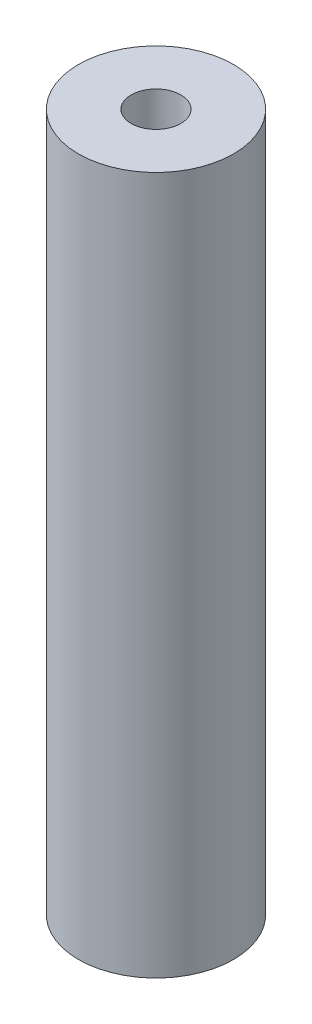
ISO-10303-21;
HEADER;
FILE_DESCRIPTION(('STEP AP214'),'2;1');
FILE_NAME('part.step','',(''),(''),'','','');
FILE_SCHEMA(('AUTOMOTIVE_DESIGN { 1 0 10303 214 1 1 1 1 }'));
ENDSEC;
DATA;
#1=APPLICATION_CONTEXT('core data for automotive mechanical design processes');
#2=APPLICATION_PROTOCOL_DEFINITION('international standard','automotive_design',2000,#1);
#3=PRODUCT_CONTEXT('',#1,'mechanical');
#4=PRODUCT('Part','Part','',(#3));
#5=PRODUCT_RELATED_PRODUCT_CATEGORY('part','',(#4));
#6=PRODUCT_DEFINITION_FORMATION('','',#4);
#7=PRODUCT_DEFINITION_CONTEXT('part definition',#1,'design');
#8=PRODUCT_DEFINITION('design','',#6,#7);
#9=PRODUCT_DEFINITION_SHAPE('','',#8);
#10=(LENGTH_UNIT() NAMED_UNIT(*) SI_UNIT(.MILLI.,.METRE.));
#11=(NAMED_UNIT(*) PLANE_ANGLE_UNIT() SI_UNIT($,.RADIAN.));
#12=(NAMED_UNIT(*) SI_UNIT($,.STERADIAN.) SOLID_ANGLE_UNIT());
#13=UNCERTAINTY_MEASURE_WITH_UNIT(LENGTH_MEASURE(1.E-05),#10,'distance_accuracy_value','');
#14=(GEOMETRIC_REPRESENTATION_CONTEXT(3) GLOBAL_UNCERTAINTY_ASSIGNED_CONTEXT((#13)) GLOBAL_UNIT_ASSIGNED_CONTEXT((#10,
#11,#12)) REPRESENTATION_CONTEXT('',''));
#15=CARTESIAN_POINT('',(0.,0.,0.));
#16=DIRECTION('',(0.,0.,1.));
#17=DIRECTION('',(1.,0.,0.));
#18=AXIS2_PLACEMENT_3D('',#15,#16,#17);
#19=CARTESIAN_POINT('',(0.,45.,0.));
#20=DIRECTION('',(0.,1.,0.));
#21=DIRECTION('',(0.,0.,1.));
#22=AXIS2_PLACEMENT_3D('',#19,#20,#21);
#23=PLANE('',#22);
#24=CARTESIAN_POINT('',(0.,45.,0.));
#25=DIRECTION('',(0.,1.,0.));
#26=DIRECTION('',(0.,0.,1.));
#27=AXIS2_PLACEMENT_3D('',#24,#25,#26);
#28=CIRCLE('',#27,5.);
#29=CARTESIAN_POINT('',(0.,45.,-5.));
#30=VERTEX_POINT('',#29);
#31=EDGE_CURVE('E10',#30,#30,#28,.T.);
#32=ORIENTED_EDGE('',*,*,#31,.T.);
#33=EDGE_LOOP('',(#32));
#34=FACE_BOUND('',#33,.T.);
#35=CARTESIAN_POINT('',(0.,45.,0.));
#36=DIRECTION('',(0.,1.,0.));
#37=DIRECTION('',(0.,0.,1.));
#38=AXIS2_PLACEMENT_3D('',#35,#36,#37);
#39=CIRCLE('',#38,1.6);
#40=CARTESIAN_POINT('',(0.,45.,-1.6));
#41=VERTEX_POINT('',#40);
#42=EDGE_CURVE('E52',#41,#41,#39,.T.);
#43=ORIENTED_EDGE('',*,*,#42,.F.);
#44=EDGE_LOOP('',(#43));
#45=FACE_BOUND('',#44,.T.);
#46=ADVANCED_FACE('F41',(#34,#45),#23,.T.);
#47=CARTESIAN_POINT('',(0.,0.,0.));
#48=DIRECTION('',(0.,1.,0.));
#49=DIRECTION('',(0.,0.,1.));
#50=AXIS2_PLACEMENT_3D('',#47,#48,#49);
#51=PLANE('',#50);
#52=CARTESIAN_POINT('',(0.,0.,0.));
#53=DIRECTION('',(0.,1.,0.));
#54=DIRECTION('',(0.,0.,1.));
#55=AXIS2_PLACEMENT_3D('',#52,#53,#54);
#56=CIRCLE('',#55,5.);
#57=CARTESIAN_POINT('',(0.,0.,-5.));
#58=VERTEX_POINT('',#57);
#59=EDGE_CURVE('E45',#58,#58,#56,.T.);
#60=ORIENTED_EDGE('',*,*,#59,.F.);
#61=EDGE_LOOP('',(#60));
#62=FACE_BOUND('',#61,.T.);
#63=CARTESIAN_POINT('',(0.,0.,0.));
#64=DIRECTION('',(0.,1.,0.));
#65=DIRECTION('',(0.,0.,1.));
#66=AXIS2_PLACEMENT_3D('',#63,#64,#65);
#67=CIRCLE('',#66,1.6);
#68=CARTESIAN_POINT('',(0.,0.,-1.6));
#69=VERTEX_POINT('',#68);
#70=EDGE_CURVE('E54',#69,#69,#67,.T.);
#71=ORIENTED_EDGE('',*,*,#70,.T.);
#72=EDGE_LOOP('',(#71));
#73=FACE_BOUND('',#72,.T.);
#74=ADVANCED_FACE('F64',(#62,#73),#51,.F.);
#75=CARTESIAN_POINT('',(0.,45.,0.));
#76=DIRECTION('',(0.,-1.,0.));
#77=DIRECTION('',(0.,0.,-1.));
#78=AXIS2_PLACEMENT_3D('',#75,#76,#77);
#79=CYLINDRICAL_SURFACE('',#78,5.);
#80=CARTESIAN_POINT('',(0.,45.,-5.));
#81=CARTESIAN_POINT('',(0.,44.53125,-5.));
#82=CARTESIAN_POINT('',(0.,44.0625,-5.));
#83=CARTESIAN_POINT('',(0.,43.125,-5.));
#84=CARTESIAN_POINT('',(0.,42.65625,-5.));
#85=CARTESIAN_POINT('',(0.,41.71875,-5.));
#86=CARTESIAN_POINT('',(0.,41.25,-5.));
#87=CARTESIAN_POINT('',(0.,40.3125,-5.));
#88=CARTESIAN_POINT('',(0.,39.84375,-5.));
#89=CARTESIAN_POINT('',(0.,38.90625,-5.));
#90=CARTESIAN_POINT('',(0.,38.4375,-5.));
#91=CARTESIAN_POINT('',(0.,37.5,-5.));
#92=CARTESIAN_POINT('',(0.,37.03125,-5.));
#93=CARTESIAN_POINT('',(0.,36.09375,-5.));
#94=CARTESIAN_POINT('',(0.,35.625,-5.));
#95=CARTESIAN_POINT('',(0.,34.6875,-5.));
#96=CARTESIAN_POINT('',(0.,34.21875,-5.));
#97=CARTESIAN_POINT('',(0.,33.28125,-5.));
#98=CARTESIAN_POINT('',(0.,32.8125,-5.));
#99=CARTESIAN_POINT('',(0.,31.875,-5.));
#100=CARTESIAN_POINT('',(0.,31.40625,-5.));
#101=CARTESIAN_POINT('',(0.,30.46875,-5.));
#102=CARTESIAN_POINT('',(0.,30.,-5.));
#103=CARTESIAN_POINT('',(0.,29.0625,-5.));
#104=CARTESIAN_POINT('',(0.,28.59375,-5.));
#105=CARTESIAN_POINT('',(0.,27.65625,-5.));
#106=CARTESIAN_POINT('',(0.,27.1875,-5.));
#107=CARTESIAN_POINT('',(0.,26.25,-5.));
#108=CARTESIAN_POINT('',(0.,25.78125,-5.));
#109=CARTESIAN_POINT('',(0.,24.84375,-5.));
#110=CARTESIAN_POINT('',(0.,24.375,-5.));
#111=CARTESIAN_POINT('',(0.,23.4375,-5.));
#112=CARTESIAN_POINT('',(0.,22.96875,-5.));
#113=CARTESIAN_POINT('',(0.,22.03125,-5.));
#114=CARTESIAN_POINT('',(0.,21.5625,-5.));
#115=CARTESIAN_POINT('',(0.,20.625,-5.));
#116=CARTESIAN_POINT('',(0.,20.15625,-5.));
#117=CARTESIAN_POINT('',(0.,19.21875,-5.));
#118=CARTESIAN_POINT('',(0.,18.75,-5.));
#119=CARTESIAN_POINT('',(0.,17.8125,-5.));
#120=CARTESIAN_POINT('',(0.,17.34375,-5.));
#121=CARTESIAN_POINT('',(0.,16.40625,-5.));
#122=CARTESIAN_POINT('',(0.,15.9375,-5.));
#123=CARTESIAN_POINT('',(0.,15.,-5.));
#124=CARTESIAN_POINT('',(0.,14.53125,-5.));
#125=CARTESIAN_POINT('',(0.,13.59375,-5.));
#126=CARTESIAN_POINT('',(0.,13.125,-5.));
#127=CARTESIAN_POINT('',(0.,12.1875,-5.));
#128=CARTESIAN_POINT('',(0.,11.71875,-5.));
#129=CARTESIAN_POINT('',(0.,10.78125,-5.));
#130=CARTESIAN_POINT('',(0.,10.3125,-5.));
#131=CARTESIAN_POINT('',(0.,9.375,-5.));
#132=CARTESIAN_POINT('',(0.,8.90625,-5.));
#133=CARTESIAN_POINT('',(0.,7.96874999999999,-5.));
#134=CARTESIAN_POINT('',(0.,7.5,-5.));
#135=CARTESIAN_POINT('',(0.,6.5625,-5.));
#136=CARTESIAN_POINT('',(0.,6.09375,-5.));
#137=CARTESIAN_POINT('',(0.,5.15625,-5.));
#138=CARTESIAN_POINT('',(0.,4.68749999999999,-5.));
#139=CARTESIAN_POINT('',(0.,3.74999999999999,-5.));
#140=CARTESIAN_POINT('',(0.,3.28124999999999,-5.));
#141=CARTESIAN_POINT('',(0.,2.34374999999999,-5.));
#142=CARTESIAN_POINT('',(0.,1.87499999999999,-5.));
#143=CARTESIAN_POINT('',(0.,0.937499999999992,-5.));
#144=CARTESIAN_POINT('',(0.,0.468749999999993,-5.));
#145=CARTESIAN_POINT('',(0.,0.,-5.));
#146=B_SPLINE_CURVE_WITH_KNOTS('',3,(#80,#81,#82,#83,#84,#85,#86,#87,#88,#89,#90,#91,#92,#93,
#94,#95,#96,#97,#98,#99,#100,#101,#102,#103,#104,#105,#106,#107,#108,#109,#110,#111,#112,#113,
#114,#115,#116,#117,#118,#119,#120,#121,#122,#123,#124,#125,#126,#127,#128,#129,#130,#131,#132,
#133,#134,#135,#136,#137,#138,#139,#140,#141,#142,#143,#144,#145),.UNSPECIFIED.,.F.,.F.,(4,2,2,
2,2,2,2,2,2,2,2,2,2,2,2,2,2,2,2,2,2,2,2,2,2,2,2,2,2,2,2,2,4),(0.,1.40625,2.8125,
4.21875000000001,5.62500000000001,7.03125,8.4375,9.84375000000001,11.25,12.65625,14.0625,
15.46875,16.875,18.28125,19.6875,21.09375,22.5,23.90625,25.3125,26.71875,28.125,29.53125,
30.9375,32.34375,33.75,35.15625,36.5625,37.96875,39.375,40.78125,42.1875,43.59375,45.),.UNSPECIFIED.);
#147=EDGE_CURVE('BSEAM43',#30,#58,#146,.T.);
#148=ORIENTED_EDGE('',*,*,#31,.F.);
#149=ORIENTED_EDGE('',*,*,#59,.T.);
#150=ORIENTED_EDGE('',*,*,#147,.T.);
#151=ORIENTED_EDGE('',*,*,#147,.F.);
#152=EDGE_LOOP('',(#148,#150,#149,#151));
#153=FACE_BOUND('',#152,.T.);
#154=ADVANCED_FACE('F43',(#153),#79,.T.);
#155=CARTESIAN_POINT('',(0.,45.,0.));
#156=DIRECTION('',(0.,-1.,0.));
#157=DIRECTION('',(0.,0.,-1.));
#158=AXIS2_PLACEMENT_3D('',#155,#156,#157);
#159=CYLINDRICAL_SURFACE('',#158,1.6);
#160=CARTESIAN_POINT('',(0.,45.,-1.6));
#161=CARTESIAN_POINT('',(0.,44.53125,-1.6));
#162=CARTESIAN_POINT('',(0.,44.0625,-1.6));
#163=CARTESIAN_POINT('',(0.,43.125,-1.6));
#164=CARTESIAN_POINT('',(0.,42.65625,-1.6));
#165=CARTESIAN_POINT('',(0.,41.71875,-1.6));
#166=CARTESIAN_POINT('',(0.,41.25,-1.6));
#167=CARTESIAN_POINT('',(0.,40.3125,-1.6));
#168=CARTESIAN_POINT('',(0.,39.84375,-1.6));
#169=CARTESIAN_POINT('',(0.,38.90625,-1.6));
#170=CARTESIAN_POINT('',(0.,38.4375,-1.6));
#171=CARTESIAN_POINT('',(0.,37.5,-1.6));
#172=CARTESIAN_POINT('',(0.,37.03125,-1.6));
#173=CARTESIAN_POINT('',(0.,36.09375,-1.6));
#174=CARTESIAN_POINT('',(0.,35.625,-1.6));
#175=CARTESIAN_POINT('',(0.,34.6875,-1.6));
#176=CARTESIAN_POINT('',(0.,34.21875,-1.6));
#177=CARTESIAN_POINT('',(0.,33.28125,-1.6));
#178=CARTESIAN_POINT('',(0.,32.8125,-1.6));
#179=CARTESIAN_POINT('',(0.,31.875,-1.6));
#180=CARTESIAN_POINT('',(0.,31.40625,-1.6));
#181=CARTESIAN_POINT('',(0.,30.46875,-1.6));
#182=CARTESIAN_POINT('',(0.,30.,-1.6));
#183=CARTESIAN_POINT('',(0.,29.0625,-1.6));
#184=CARTESIAN_POINT('',(0.,28.59375,-1.6));
#185=CARTESIAN_POINT('',(0.,27.65625,-1.6));
#186=CARTESIAN_POINT('',(0.,27.1875,-1.6));
#187=CARTESIAN_POINT('',(0.,26.25,-1.6));
#188=CARTESIAN_POINT('',(0.,25.78125,-1.6));
#189=CARTESIAN_POINT('',(0.,24.84375,-1.6));
#190=CARTESIAN_POINT('',(0.,24.375,-1.6));
#191=CARTESIAN_POINT('',(0.,23.4375,-1.6));
#192=CARTESIAN_POINT('',(0.,22.96875,-1.6));
#193=CARTESIAN_POINT('',(0.,22.03125,-1.6));
#194=CARTESIAN_POINT('',(0.,21.5625,-1.6));
#195=CARTESIAN_POINT('',(0.,20.625,-1.6));
#196=CARTESIAN_POINT('',(0.,20.15625,-1.6));
#197=CARTESIAN_POINT('',(0.,19.21875,-1.6));
#198=CARTESIAN_POINT('',(0.,18.75,-1.6));
#199=CARTESIAN_POINT('',(0.,17.8125,-1.6));
#200=CARTESIAN_POINT('',(0.,17.34375,-1.6));
#201=CARTESIAN_POINT('',(0.,16.40625,-1.6));
#202=CARTESIAN_POINT('',(0.,15.9375,-1.6));
#203=CARTESIAN_POINT('',(0.,15.,-1.6));
#204=CARTESIAN_POINT('',(0.,14.53125,-1.6));
#205=CARTESIAN_POINT('',(0.,13.59375,-1.6));
#206=CARTESIAN_POINT('',(0.,13.125,-1.6));
#207=CARTESIAN_POINT('',(0.,12.1875,-1.6));
#208=CARTESIAN_POINT('',(0.,11.71875,-1.6));
#209=CARTESIAN_POINT('',(0.,10.78125,-1.6));
#210=CARTESIAN_POINT('',(0.,10.3125,-1.6));
#211=CARTESIAN_POINT('',(0.,9.375,-1.6));
#212=CARTESIAN_POINT('',(0.,8.90625,-1.6));
#213=CARTESIAN_POINT('',(0.,7.96874999999999,-1.6));
#214=CARTESIAN_POINT('',(0.,7.5,-1.6));
#215=CARTESIAN_POINT('',(0.,6.5625,-1.6));
#216=CARTESIAN_POINT('',(0.,6.09375,-1.6));
#217=CARTESIAN_POINT('',(0.,5.15625,-1.6));
#218=CARTESIAN_POINT('',(0.,4.68749999999999,-1.6));
#219=CARTESIAN_POINT('',(0.,3.74999999999999,-1.6));
#220=CARTESIAN_POINT('',(0.,3.28124999999999,-1.6));
#221=CARTESIAN_POINT('',(0.,2.34374999999999,-1.6));
#222=CARTESIAN_POINT('',(0.,1.87499999999999,-1.6));
#223=CARTESIAN_POINT('',(0.,0.937499999999992,-1.6));
#224=CARTESIAN_POINT('',(0.,0.468749999999993,-1.6));
#225=CARTESIAN_POINT('',(0.,0.,-1.6));
#226=B_SPLINE_CURVE_WITH_KNOTS('',3,(#160,#161,#162,#163,#164,#165,#166,#167,#168,#169,#170,
#171,#172,#173,#174,#175,#176,#177,#178,#179,#180,#181,#182,#183,#184,#185,#186,#187,#188,#189,
#190,#191,#192,#193,#194,#195,#196,#197,#198,#199,#200,#201,#202,#203,#204,#205,#206,#207,#208,
#209,#210,#211,#212,#213,#214,#215,#216,#217,#218,#219,#220,#221,#222,#223,#224,#225),
.UNSPECIFIED.,.F.,.F.,(4,2,2,2,2,2,2,2,2,2,2,2,2,2,2,2,2,2,2,2,2,2,2,2,2,2,2,2,2,2,2,2,4),(0.,
1.40625,2.8125,4.21875000000001,5.62500000000001,7.03125,8.4375,9.84375000000001,11.25,12.65625,
14.0625,15.46875,16.875,18.28125,19.6875,21.09375,22.5,23.90625,25.3125,26.71875,28.125,
29.53125,30.9375,32.34375,33.75,35.15625,36.5625,37.96875,39.375,40.78125,42.1875,43.59375,45.),.UNSPECIFIED.);
#227=EDGE_CURVE('BSEAM60',#41,#69,#226,.T.);
#228=ORIENTED_EDGE('',*,*,#42,.T.);
#229=ORIENTED_EDGE('',*,*,#70,.F.);
#230=ORIENTED_EDGE('',*,*,#227,.T.);
#231=ORIENTED_EDGE('',*,*,#227,.F.);
#232=EDGE_LOOP('',(#228,#230,#229,#231));
#233=FACE_BOUND('',#232,.T.);
#234=ADVANCED_FACE('F60',(#233),#159,.F.);
#235=CLOSED_SHELL('',(#46,#74,#154,#234));
#236=MANIFOLD_SOLID_BREP('B2',#235);
#237=ADVANCED_BREP_SHAPE_REPRESENTATION('',(#18,#236),#14);
#238=SHAPE_DEFINITION_REPRESENTATION(#9,#237);
ENDSEC;
END-ISO-10303-21;
